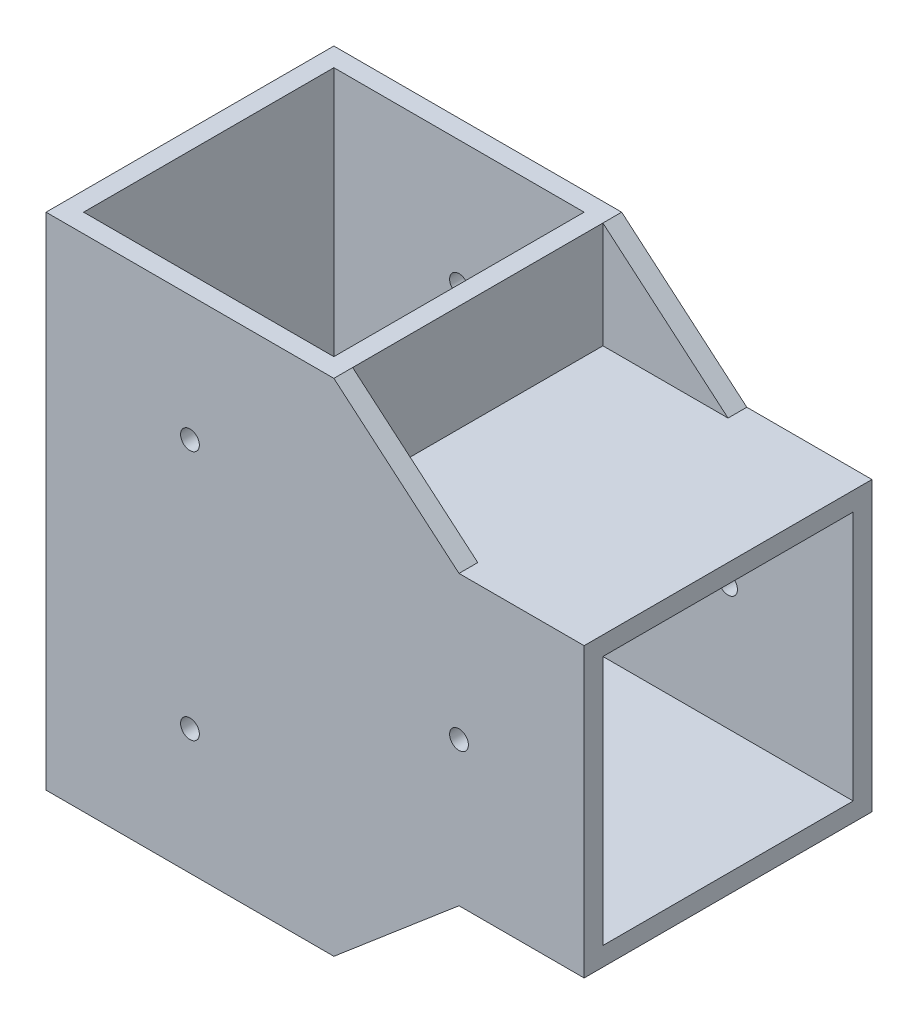
ISO-10303-21;
HEADER;
FILE_DESCRIPTION(('STEP AP214'),'2;1');
FILE_NAME('part.step','',(''),(''),'','','');
FILE_SCHEMA(('AUTOMOTIVE_DESIGN { 1 0 10303 214 1 1 1 1 }'));
ENDSEC;
DATA;
#1=APPLICATION_CONTEXT('core data for automotive mechanical design processes');
#2=APPLICATION_PROTOCOL_DEFINITION('international standard','automotive_design',2000,#1);
#3=PRODUCT_CONTEXT('',#1,'mechanical');
#4=PRODUCT('Part','Part','',(#3));
#5=PRODUCT_RELATED_PRODUCT_CATEGORY('part','',(#4));
#6=PRODUCT_DEFINITION_FORMATION('','',#4);
#7=PRODUCT_DEFINITION_CONTEXT('part definition',#1,'design');
#8=PRODUCT_DEFINITION('design','',#6,#7);
#9=PRODUCT_DEFINITION_SHAPE('','',#8);
#10=(LENGTH_UNIT() NAMED_UNIT(*) SI_UNIT(.MILLI.,.METRE.));
#11=(NAMED_UNIT(*) PLANE_ANGLE_UNIT() SI_UNIT($,.RADIAN.));
#12=(NAMED_UNIT(*) SI_UNIT($,.STERADIAN.) SOLID_ANGLE_UNIT());
#13=UNCERTAINTY_MEASURE_WITH_UNIT(LENGTH_MEASURE(1.E-05),#10,'distance_accuracy_value','');
#14=(GEOMETRIC_REPRESENTATION_CONTEXT(3) GLOBAL_UNCERTAINTY_ASSIGNED_CONTEXT((#13)) GLOBAL_UNIT_ASSIGNED_CONTEXT((#10,
#11,#12)) REPRESENTATION_CONTEXT('',''));
#15=CARTESIAN_POINT('',(0.,0.,0.));
#16=DIRECTION('',(0.,0.,1.));
#17=DIRECTION('',(1.,0.,0.));
#18=AXIS2_PLACEMENT_3D('',#15,#16,#17);
#19=CARTESIAN_POINT('',(0.,0.,3.));
#20=DIRECTION('',(0.,0.,-1.));
#21=DIRECTION('',(-1.,0.,0.));
#22=AXIS2_PLACEMENT_3D('',#19,#20,#21);
#23=PLANE('',#22);
#24=CARTESIAN_POINT('',(-43.,20.,3.));
#25=DIRECTION('',(0.,0.,-1.));
#26=DIRECTION('',(-1.,0.,0.));
#27=AXIS2_PLACEMENT_3D('',#24,#25,#26);
#28=CIRCLE('',#27,1.5);
#29=CARTESIAN_POINT('',(-44.5,20.,3.));
#30=VERTEX_POINT('',#29);
#31=EDGE_CURVE('E225',#30,#30,#28,.T.);
#32=ORIENTED_EDGE('',*,*,#31,.T.);
#33=EDGE_LOOP('',(#32));
#34=FACE_BOUND('',#33,.T.);
#35=CARTESIAN_POINT('',(-43.,-20.,3.));
#36=DIRECTION('',(0.,0.,-1.));
#37=DIRECTION('',(-1.,0.,0.));
#38=AXIS2_PLACEMENT_3D('',#35,#36,#37);
#39=CIRCLE('',#38,1.5);
#40=CARTESIAN_POINT('',(-44.5,-20.,3.));
#41=VERTEX_POINT('',#40);
#42=EDGE_CURVE('E474',#41,#41,#39,.T.);
#43=ORIENTED_EDGE('',*,*,#42,.T.);
#44=EDGE_LOOP('',(#43));
#45=FACE_BOUND('',#44,.T.);
#46=DIRECTION('',(0.,1.,0.));
#47=VECTOR('',#46,1.);
#48=CARTESIAN_POINT('',(-63.,40.,3.));
#49=LINE('',#48,#47);
#50=CARTESIAN_POINT('',(-63.,-40.,3.));
#51=VERTEX_POINT('',#50);
#52=CARTESIAN_POINT('',(-63.,40.,3.));
#53=VERTEX_POINT('',#52);
#54=EDGE_CURVE('E386',#51,#53,#49,.T.);
#55=ORIENTED_EDGE('',*,*,#54,.F.);
#56=DIRECTION('',(-1.,0.,0.));
#57=VECTOR('',#56,1.);
#58=CARTESIAN_POINT('',(-66.,-40.,3.));
#59=LINE('',#58,#57);
#60=CARTESIAN_POINT('',(-23.,-40.,3.));
#61=VERTEX_POINT('',#60);
#62=EDGE_CURVE('E353',#61,#51,#59,.T.);
#63=ORIENTED_EDGE('',*,*,#62,.F.);
#64=DIRECTION('',(0.,-1.,0.));
#65=VECTOR('',#64,1.);
#66=CARTESIAN_POINT('',(-23.,40.,3.));
#67=LINE('',#66,#65);
#68=CARTESIAN_POINT('',(-23.,40.,3.));
#69=VERTEX_POINT('',#68);
#70=EDGE_CURVE('E393',#69,#61,#67,.T.);
#71=ORIENTED_EDGE('',*,*,#70,.F.);
#72=DIRECTION('',(-1.,0.,0.));
#73=VECTOR('',#72,1.);
#74=CARTESIAN_POINT('',(-66.,40.,3.));
#75=LINE('',#74,#73);
#76=EDGE_CURVE('E61',#69,#53,#75,.T.);
#77=ORIENTED_EDGE('',*,*,#76,.T.);
#78=EDGE_LOOP('',(#55,#63,#71,#77));
#79=FACE_BOUND('',#78,.T.);
#80=ADVANCED_FACE('F43',(#34,#45,#79),#23,.F.);
#81=CARTESIAN_POINT('',(0.,0.,3.));
#82=DIRECTION('',(0.,0.,-1.));
#83=DIRECTION('',(-1.,0.,0.));
#84=AXIS2_PLACEMENT_3D('',#81,#82,#83);
#85=CIRCLE('',#84,1.5);
#86=CARTESIAN_POINT('',(-1.5,0.,3.));
#87=VERTEX_POINT('',#86);
#88=EDGE_CURVE('E468',#87,#87,#85,.T.);
#89=ORIENTED_EDGE('',*,*,#88,.T.);
#90=EDGE_LOOP('',(#89));
#91=FACE_BOUND('',#90,.T.);
#92=DIRECTION('',(1.,0.,0.));
#93=VECTOR('',#92,1.);
#94=CARTESIAN_POINT('',(-20.,20.,3.));
#95=LINE('',#94,#93);
#96=CARTESIAN_POINT('',(-20.,20.,3.));
#97=VERTEX_POINT('',#96);
#98=CARTESIAN_POINT('',(20.,20.,3.));
#99=VERTEX_POINT('',#98);
#100=EDGE_CURVE('E69',#97,#99,#95,.T.);
#101=ORIENTED_EDGE('',*,*,#100,.F.);
#102=DIRECTION('',(0.,1.,0.));
#103=VECTOR('',#102,1.);
#104=CARTESIAN_POINT('',(-20.,0.,3.));
#105=LINE('',#104,#103);
#106=CARTESIAN_POINT('',(-20.,-20.,3.));
#107=VERTEX_POINT('',#106);
#108=EDGE_CURVE('E396',#107,#97,#105,.T.);
#109=ORIENTED_EDGE('',*,*,#108,.F.);
#110=DIRECTION('',(1.,0.,0.));
#111=VECTOR('',#110,1.);
#112=CARTESIAN_POINT('',(-20.,-20.,3.));
#113=LINE('',#112,#111);
#114=CARTESIAN_POINT('',(20.,-20.,3.));
#115=VERTEX_POINT('',#114);
#116=EDGE_CURVE('E331',#107,#115,#113,.T.);
#117=ORIENTED_EDGE('',*,*,#116,.T.);
#118=DIRECTION('',(0.,1.,0.));
#119=VECTOR('',#118,1.);
#120=CARTESIAN_POINT('',(20.,23.,3.));
#121=LINE('',#120,#119);
#122=EDGE_CURVE('E422',#115,#99,#121,.T.);
#123=ORIENTED_EDGE('',*,*,#122,.T.);
#124=EDGE_LOOP('',(#101,#109,#117,#123));
#125=FACE_BOUND('',#124,.T.);
#126=ADVANCED_FACE('F568',(#91,#125),#23,.F.);
#127=DIRECTION('',(0.,1.,0.));
#128=VECTOR('',#127,1.);
#129=CARTESIAN_POINT('',(-20.,23.,3.));
#130=LINE('',#129,#128);
#131=CARTESIAN_POINT('',(-20.,23.,3.));
#132=VERTEX_POINT('',#131);
#133=CARTESIAN_POINT('',(-20.,40.,3.));
#134=VERTEX_POINT('',#133);
#135=EDGE_CURVE('E388',#132,#134,#130,.T.);
#136=ORIENTED_EDGE('',*,*,#135,.F.);
#137=DIRECTION('',(-1.,0.,0.));
#138=VECTOR('',#137,1.);
#139=CARTESIAN_POINT('',(20.,23.,3.));
#140=LINE('',#139,#138);
#141=CARTESIAN_POINT('',(0.,23.,3.));
#142=VERTEX_POINT('',#141);
#143=EDGE_CURVE('E11',#142,#132,#140,.T.);
#144=ORIENTED_EDGE('',*,*,#143,.F.);
#145=DIRECTION('',(-0.761939317759459,0.64764842009554,0.));
#146=VECTOR('',#145,1.);
#147=CARTESIAN_POINT('',(-20.,40.,3.));
#148=LINE('',#147,#146);
#149=EDGE_CURVE('E425',#142,#134,#148,.T.);
#150=ORIENTED_EDGE('',*,*,#149,.T.);
#151=EDGE_LOOP('',(#136,#144,#150));
#152=FACE_BOUND('',#151,.T.);
#153=ADVANCED_FACE('F548',(#152),#23,.F.);
#154=CARTESIAN_POINT('',(-66.,0.,3.));
#155=DIRECTION('',(1.,0.,0.));
#156=DIRECTION('',(0.,0.,-1.));
#157=AXIS2_PLACEMENT_3D('',#154,#155,#156);
#158=PLANE('',#157);
#159=DIRECTION('',(0.,-1.,0.));
#160=VECTOR('',#159,1.);
#161=CARTESIAN_POINT('',(-66.,0.,0.));
#162=LINE('',#161,#160);
#163=CARTESIAN_POINT('',(-66.,40.,0.));
#164=VERTEX_POINT('',#163);
#165=CARTESIAN_POINT('',(-66.,-40.,0.));
#166=VERTEX_POINT('',#165);
#167=EDGE_CURVE('E421',#164,#166,#162,.T.);
#168=ORIENTED_EDGE('',*,*,#167,.T.);
#169=DIRECTION('',(0.,0.,-1.));
#170=VECTOR('',#169,1.);
#171=CARTESIAN_POINT('',(-66.,-40.,3.));
#172=LINE('',#171,#170);
#173=CARTESIAN_POINT('',(-66.,-40.,46.));
#174=VERTEX_POINT('',#173);
#175=EDGE_CURVE('E358',#174,#166,#172,.T.);
#176=ORIENTED_EDGE('',*,*,#175,.F.);
#177=DIRECTION('',(0.,-1.,0.));
#178=VECTOR('',#177,1.);
#179=CARTESIAN_POINT('',(-66.,0.,46.));
#180=LINE('',#179,#178);
#181=CARTESIAN_POINT('',(-66.,40.,46.));
#182=VERTEX_POINT('',#181);
#183=EDGE_CURVE('E282',#182,#174,#180,.T.);
#184=ORIENTED_EDGE('',*,*,#183,.F.);
#185=DIRECTION('',(0.,0.,-1.));
#186=VECTOR('',#185,1.);
#187=CARTESIAN_POINT('',(-66.,40.,3.));
#188=LINE('',#187,#186);
#189=EDGE_CURVE('E431',#182,#164,#188,.T.);
#190=ORIENTED_EDGE('',*,*,#189,.T.);
#191=EDGE_LOOP('',(#168,#176,#184,#190));
#192=FACE_BOUND('',#191,.T.);
#193=ADVANCED_FACE('F45',(#192),#158,.F.);
#194=CARTESIAN_POINT('',(20.,23.,3.));
#195=DIRECTION('',(-1.,0.,0.));
#196=DIRECTION('',(0.,-1.,0.));
#197=AXIS2_PLACEMENT_3D('',#194,#195,#196);
#198=PLANE('',#197);
#199=DIRECTION('',(0.,0.,-1.));
#200=VECTOR('',#199,1.);
#201=CARTESIAN_POINT('',(20.,23.,3.));
#202=LINE('',#201,#200);
#203=CARTESIAN_POINT('',(20.,23.,46.));
#204=VERTEX_POINT('',#203);
#205=CARTESIAN_POINT('',(20.,23.,0.));
#206=VERTEX_POINT('',#205);
#207=EDGE_CURVE('E53',#204,#206,#202,.T.);
#208=ORIENTED_EDGE('',*,*,#207,.F.);
#209=DIRECTION('',(0.,1.,0.));
#210=VECTOR('',#209,1.);
#211=CARTESIAN_POINT('',(20.,23.,46.));
#212=LINE('',#211,#210);
#213=CARTESIAN_POINT('',(20.,-23.,46.));
#214=VERTEX_POINT('',#213);
#215=EDGE_CURVE('E300',#214,#204,#212,.T.);
#216=ORIENTED_EDGE('',*,*,#215,.F.);
#217=DIRECTION('',(0.,0.,-1.));
#218=VECTOR('',#217,1.);
#219=CARTESIAN_POINT('',(20.,-23.,3.));
#220=LINE('',#219,#218);
#221=CARTESIAN_POINT('',(20.,-23.,0.));
#222=VERTEX_POINT('',#221);
#223=EDGE_CURVE('E328',#214,#222,#220,.T.);
#224=ORIENTED_EDGE('',*,*,#223,.T.);
#225=DIRECTION('',(0.,1.,0.));
#226=VECTOR('',#225,1.);
#227=CARTESIAN_POINT('',(20.,23.,0.));
#228=LINE('',#227,#226);
#229=EDGE_CURVE('E434',#222,#206,#228,.T.);
#230=ORIENTED_EDGE('',*,*,#229,.T.);
#231=EDGE_LOOP('',(#208,#216,#224,#230));
#232=FACE_BOUND('',#231,.T.);
#233=DIRECTION('',(0.,1.,0.));
#234=VECTOR('',#233,1.);
#235=CARTESIAN_POINT('',(20.,23.,43.));
#236=LINE('',#235,#234);
#237=CARTESIAN_POINT('',(20.,-20.,43.));
#238=VERTEX_POINT('',#237);
#239=CARTESIAN_POINT('',(20.,20.,43.));
#240=VERTEX_POINT('',#239);
#241=EDGE_CURVE('E283',#238,#240,#236,.T.);
#242=ORIENTED_EDGE('',*,*,#241,.T.);
#243=DIRECTION('',(0.,0.,-1.));
#244=VECTOR('',#243,1.);
#245=CARTESIAN_POINT('',(20.,20.,23.));
#246=LINE('',#245,#244);
#247=EDGE_CURVE('E401',#240,#99,#246,.T.);
#248=ORIENTED_EDGE('',*,*,#247,.T.);
#249=ORIENTED_EDGE('',*,*,#122,.F.);
#250=DIRECTION('',(0.,0.,-1.));
#251=VECTOR('',#250,1.);
#252=CARTESIAN_POINT('',(20.,-20.,23.));
#253=LINE('',#252,#251);
#254=EDGE_CURVE('E335',#238,#115,#253,.T.);
#255=ORIENTED_EDGE('',*,*,#254,.F.);
#256=EDGE_LOOP('',(#242,#248,#249,#255));
#257=FACE_BOUND('',#256,.T.);
#258=ADVANCED_FACE('F521',(#232,#257),#198,.F.);
#259=CARTESIAN_POINT('',(0.,23.,3.));
#260=DIRECTION('',(0.,-1.,0.));
#261=DIRECTION('',(0.,0.,-1.));
#262=AXIS2_PLACEMENT_3D('',#259,#260,#261);
#263=PLANE('',#262);
#264=DIRECTION('',(-1.,0.,0.));
#265=VECTOR('',#264,1.);
#266=CARTESIAN_POINT('',(0.,23.,0.));
#267=LINE('',#266,#265);
#268=CARTESIAN_POINT('',(0.,23.,0.));
#269=VERTEX_POINT('',#268);
#270=EDGE_CURVE('E437',#206,#269,#267,.T.);
#271=ORIENTED_EDGE('',*,*,#270,.T.);
#272=DIRECTION('',(0.,0.,-1.));
#273=VECTOR('',#272,1.);
#274=CARTESIAN_POINT('',(0.,23.,3.));
#275=LINE('',#274,#273);
#276=EDGE_CURVE('E452',#142,#269,#275,.T.);
#277=ORIENTED_EDGE('',*,*,#276,.F.);
#278=ORIENTED_EDGE('',*,*,#143,.T.);
#279=DIRECTION('',(0.,0.,-1.));
#280=VECTOR('',#279,1.);
#281=CARTESIAN_POINT('',(-20.,23.,23.));
#282=LINE('',#281,#280);
#283=CARTESIAN_POINT('',(-20.,23.,43.));
#284=VERTEX_POINT('',#283);
#285=EDGE_CURVE('E417',#284,#132,#282,.T.);
#286=ORIENTED_EDGE('',*,*,#285,.F.);
#287=DIRECTION('',(-1.,0.,0.));
#288=VECTOR('',#287,1.);
#289=CARTESIAN_POINT('',(20.,23.,43.));
#290=LINE('',#289,#288);
#291=CARTESIAN_POINT('',(0.,23.,43.));
#292=VERTEX_POINT('',#291);
#293=EDGE_CURVE('E261',#292,#284,#290,.T.);
#294=ORIENTED_EDGE('',*,*,#293,.F.);
#295=DIRECTION('',(0.,0.,1.));
#296=VECTOR('',#295,1.);
#297=CARTESIAN_POINT('',(0.,23.,43.));
#298=LINE('',#297,#296);
#299=CARTESIAN_POINT('',(0.,23.,46.));
#300=VERTEX_POINT('',#299);
#301=EDGE_CURVE('E266',#292,#300,#298,.T.);
#302=ORIENTED_EDGE('',*,*,#301,.T.);
#303=DIRECTION('',(-1.,0.,0.));
#304=VECTOR('',#303,1.);
#305=CARTESIAN_POINT('',(0.,23.,46.));
#306=LINE('',#305,#304);
#307=EDGE_CURVE('E304',#204,#300,#306,.T.);
#308=ORIENTED_EDGE('',*,*,#307,.F.);
#309=ORIENTED_EDGE('',*,*,#207,.T.);
#310=EDGE_LOOP('',(#271,#277,#278,#286,#294,#302,#308,#309));
#311=FACE_BOUND('',#310,.T.);
#312=ADVANCED_FACE('F526',(#311),#263,.F.);
#313=CARTESIAN_POINT('',(-20.,40.,3.));
#314=DIRECTION('',(-0.64764842009554,-0.761939317759459,0.));
#315=DIRECTION('',(0.76193931775946,-0.64764842009554,0.));
#316=AXIS2_PLACEMENT_3D('',#313,#314,#315);
#317=PLANE('',#316);
#318=DIRECTION('',(-0.761939317759459,0.64764842009554,0.));
#319=VECTOR('',#318,1.);
#320=CARTESIAN_POINT('',(-20.,40.,0.));
#321=LINE('',#320,#319);
#322=CARTESIAN_POINT('',(-20.,40.,0.));
#323=VERTEX_POINT('',#322);
#324=EDGE_CURVE('E440',#269,#323,#321,.T.);
#325=ORIENTED_EDGE('',*,*,#324,.T.);
#326=DIRECTION('',(0.,0.,-1.));
#327=VECTOR('',#326,1.);
#328=CARTESIAN_POINT('',(-20.,40.,3.));
#329=LINE('',#328,#327);
#330=EDGE_CURVE('E448',#134,#323,#329,.T.);
#331=ORIENTED_EDGE('',*,*,#330,.F.);
#332=ORIENTED_EDGE('',*,*,#149,.F.);
#333=ORIENTED_EDGE('',*,*,#276,.T.);
#334=EDGE_LOOP('',(#325,#331,#332,#333));
#335=FACE_BOUND('',#334,.T.);
#336=ADVANCED_FACE('F546',(#335),#317,.F.);
#337=CARTESIAN_POINT('',(-66.,40.,3.));
#338=DIRECTION('',(0.,-1.,0.));
#339=DIRECTION('',(0.,0.,-1.));
#340=AXIS2_PLACEMENT_3D('',#337,#338,#339);
#341=PLANE('',#340);
#342=DIRECTION('',(0.,0.,-1.));
#343=VECTOR('',#342,1.);
#344=CARTESIAN_POINT('',(-23.,40.,23.));
#345=LINE('',#344,#343);
#346=CARTESIAN_POINT('',(-23.,40.,43.));
#347=VERTEX_POINT('',#346);
#348=EDGE_CURVE('E409',#347,#69,#345,.T.);
#349=ORIENTED_EDGE('',*,*,#348,.F.);
#350=DIRECTION('',(-1.,0.,0.));
#351=VECTOR('',#350,1.);
#352=CARTESIAN_POINT('',(-66.,40.,43.));
#353=LINE('',#352,#351);
#354=CARTESIAN_POINT('',(-63.,40.,43.));
#355=VERTEX_POINT('',#354);
#356=EDGE_CURVE('E292',#347,#355,#353,.T.);
#357=ORIENTED_EDGE('',*,*,#356,.T.);
#358=DIRECTION('',(0.,0.,-1.));
#359=VECTOR('',#358,1.);
#360=CARTESIAN_POINT('',(-63.,40.,23.));
#361=LINE('',#360,#359);
#362=EDGE_CURVE('E327',#355,#53,#361,.T.);
#363=ORIENTED_EDGE('',*,*,#362,.T.);
#364=ORIENTED_EDGE('',*,*,#76,.F.);
#365=EDGE_LOOP('',(#349,#357,#363,#364));
#366=FACE_BOUND('',#365,.T.);
#367=DIRECTION('',(-1.,0.,0.));
#368=VECTOR('',#367,1.);
#369=CARTESIAN_POINT('',(-66.,40.,0.));
#370=LINE('',#369,#368);
#371=EDGE_CURVE('E426',#323,#164,#370,.T.);
#372=ORIENTED_EDGE('',*,*,#371,.T.);
#373=ORIENTED_EDGE('',*,*,#189,.F.);
#374=DIRECTION('',(-1.,0.,0.));
#375=VECTOR('',#374,1.);
#376=CARTESIAN_POINT('',(-66.,40.,46.));
#377=LINE('',#376,#375);
#378=CARTESIAN_POINT('',(-20.,40.,46.));
#379=VERTEX_POINT('',#378);
#380=EDGE_CURVE('E288',#379,#182,#377,.T.);
#381=ORIENTED_EDGE('',*,*,#380,.F.);
#382=DIRECTION('',(0.,0.,1.));
#383=VECTOR('',#382,1.);
#384=CARTESIAN_POINT('',(-20.,40.,43.));
#385=LINE('',#384,#383);
#386=CARTESIAN_POINT('',(-20.,40.,43.));
#387=VERTEX_POINT('',#386);
#388=EDGE_CURVE('E296',#387,#379,#385,.T.);
#389=ORIENTED_EDGE('',*,*,#388,.F.);
#390=DIRECTION('',(0.,0.,-1.));
#391=VECTOR('',#390,1.);
#392=CARTESIAN_POINT('',(-20.,40.,23.));
#393=LINE('',#392,#391);
#394=EDGE_CURVE('E413',#387,#134,#393,.T.);
#395=ORIENTED_EDGE('',*,*,#394,.T.);
#396=ORIENTED_EDGE('',*,*,#330,.T.);
#397=EDGE_LOOP('',(#372,#373,#381,#389,#395,#396));
#398=FACE_BOUND('',#397,.T.);
#399=ADVANCED_FACE('F532',(#366,#398),#341,.F.);
#400=CARTESIAN_POINT('',(0.,0.,0.));
#401=DIRECTION('',(0.,0.,-1.));
#402=DIRECTION('',(-1.,0.,0.));
#403=AXIS2_PLACEMENT_3D('',#400,#401,#402);
#404=PLANE('',#403);
#405=CARTESIAN_POINT('',(-43.,20.,0.));
#406=DIRECTION('',(0.,0.,1.));
#407=DIRECTION('',(1.,0.,0.));
#408=AXIS2_PLACEMENT_3D('',#405,#406,#407);
#409=CIRCLE('',#408,1.5);
#410=CARTESIAN_POINT('',(-41.5,20.,0.));
#411=VERTEX_POINT('',#410);
#412=EDGE_CURVE('E463',#411,#411,#409,.T.);
#413=ORIENTED_EDGE('',*,*,#412,.T.);
#414=EDGE_LOOP('',(#413));
#415=FACE_BOUND('',#414,.T.);
#416=CARTESIAN_POINT('',(-43.,-20.,0.));
#417=DIRECTION('',(0.,0.,1.));
#418=DIRECTION('',(1.,0.,0.));
#419=AXIS2_PLACEMENT_3D('',#416,#417,#418);
#420=CIRCLE('',#419,1.5);
#421=CARTESIAN_POINT('',(-41.5,-20.,0.));
#422=VERTEX_POINT('',#421);
#423=EDGE_CURVE('E605',#422,#422,#420,.T.);
#424=ORIENTED_EDGE('',*,*,#423,.T.);
#425=EDGE_LOOP('',(#424));
#426=FACE_BOUND('',#425,.T.);
#427=CARTESIAN_POINT('',(0.,0.,0.));
#428=DIRECTION('',(0.,0.,1.));
#429=DIRECTION('',(1.,0.,0.));
#430=AXIS2_PLACEMENT_3D('',#427,#428,#429);
#431=CIRCLE('',#430,1.5);
#432=CARTESIAN_POINT('',(1.5,0.,0.));
#433=VERTEX_POINT('',#432);
#434=EDGE_CURVE('E608',#433,#433,#431,.T.);
#435=ORIENTED_EDGE('',*,*,#434,.T.);
#436=EDGE_LOOP('',(#435));
#437=FACE_BOUND('',#436,.T.);
#438=ORIENTED_EDGE('',*,*,#167,.F.);
#439=ORIENTED_EDGE('',*,*,#371,.F.);
#440=ORIENTED_EDGE('',*,*,#324,.F.);
#441=ORIENTED_EDGE('',*,*,#270,.F.);
#442=ORIENTED_EDGE('',*,*,#229,.F.);
#443=DIRECTION('',(-1.,0.,0.));
#444=VECTOR('',#443,1.);
#445=CARTESIAN_POINT('',(0.,-23.,0.));
#446=LINE('',#445,#444);
#447=CARTESIAN_POINT('',(0.,-23.,0.));
#448=VERTEX_POINT('',#447);
#449=EDGE_CURVE('E206',#222,#448,#446,.T.);
#450=ORIENTED_EDGE('',*,*,#449,.T.);
#451=DIRECTION('',(-0.761939317759459,-0.64764842009554,0.));
#452=VECTOR('',#451,1.);
#453=CARTESIAN_POINT('',(-20.,-40.,0.));
#454=LINE('',#453,#452);
#455=CARTESIAN_POINT('',(-20.,-40.,0.));
#456=VERTEX_POINT('',#455);
#457=EDGE_CURVE('E362',#448,#456,#454,.T.);
#458=ORIENTED_EDGE('',*,*,#457,.T.);
#459=DIRECTION('',(-1.,0.,0.));
#460=VECTOR('',#459,1.);
#461=CARTESIAN_POINT('',(-66.,-40.,0.));
#462=LINE('',#461,#460);
#463=EDGE_CURVE('E354',#456,#166,#462,.T.);
#464=ORIENTED_EDGE('',*,*,#463,.T.);
#465=EDGE_LOOP('',(#438,#439,#440,#441,#442,#450,#458,#464));
#466=FACE_BOUND('',#465,.T.);
#467=ADVANCED_FACE('F537',(#415,#426,#437,#466),#404,.T.);
#468=CARTESIAN_POINT('',(-20.,23.,23.));
#469=DIRECTION('',(-1.,0.,0.));
#470=DIRECTION('',(0.,0.,1.));
#471=AXIS2_PLACEMENT_3D('',#468,#469,#470);
#472=PLANE('',#471);
#473=ORIENTED_EDGE('',*,*,#135,.T.);
#474=ORIENTED_EDGE('',*,*,#394,.F.);
#475=DIRECTION('',(0.,1.,0.));
#476=VECTOR('',#475,1.);
#477=CARTESIAN_POINT('',(-20.,23.,43.));
#478=LINE('',#477,#476);
#479=EDGE_CURVE('E260',#284,#387,#478,.T.);
#480=ORIENTED_EDGE('',*,*,#479,.F.);
#481=ORIENTED_EDGE('',*,*,#285,.T.);
#482=EDGE_LOOP('',(#473,#474,#480,#481));
#483=FACE_BOUND('',#482,.T.);
#484=ADVANCED_FACE('F551',(#483),#472,.F.);
#485=CARTESIAN_POINT('',(-23.,40.,23.));
#486=DIRECTION('',(1.,0.,0.));
#487=DIRECTION('',(0.,1.,0.));
#488=AXIS2_PLACEMENT_3D('',#485,#486,#487);
#489=PLANE('',#488);
#490=ORIENTED_EDGE('',*,*,#70,.T.);
#491=DIRECTION('',(0.,0.,-1.));
#492=VECTOR('',#491,1.);
#493=CARTESIAN_POINT('',(-23.,-40.,23.));
#494=LINE('',#493,#492);
#495=CARTESIAN_POINT('',(-23.,-40.,43.));
#496=VERTEX_POINT('',#495);
#497=EDGE_CURVE('E343',#496,#61,#494,.T.);
#498=ORIENTED_EDGE('',*,*,#497,.F.);
#499=DIRECTION('',(0.,-1.,0.));
#500=VECTOR('',#499,1.);
#501=CARTESIAN_POINT('',(-23.,40.,43.));
#502=LINE('',#501,#500);
#503=EDGE_CURVE('E270',#347,#496,#502,.T.);
#504=ORIENTED_EDGE('',*,*,#503,.F.);
#505=ORIENTED_EDGE('',*,*,#348,.T.);
#506=EDGE_LOOP('',(#490,#498,#504,#505));
#507=FACE_BOUND('',#506,.T.);
#508=ADVANCED_FACE('F598',(#507),#489,.F.);
#509=CARTESIAN_POINT('',(-20.,0.,23.));
#510=DIRECTION('',(-1.,0.,0.));
#511=DIRECTION('',(0.,0.,1.));
#512=AXIS2_PLACEMENT_3D('',#509,#510,#511);
#513=PLANE('',#512);
#514=ORIENTED_EDGE('',*,*,#108,.T.);
#515=DIRECTION('',(0.,0.,-1.));
#516=VECTOR('',#515,1.);
#517=CARTESIAN_POINT('',(-20.,20.,23.));
#518=LINE('',#517,#516);
#519=CARTESIAN_POINT('',(-20.,20.,43.));
#520=VERTEX_POINT('',#519);
#521=EDGE_CURVE('E405',#520,#97,#518,.T.);
#522=ORIENTED_EDGE('',*,*,#521,.F.);
#523=DIRECTION('',(0.,1.,0.));
#524=VECTOR('',#523,1.);
#525=CARTESIAN_POINT('',(-20.,0.,43.));
#526=LINE('',#525,#524);
#527=CARTESIAN_POINT('',(-20.,-20.,43.));
#528=VERTEX_POINT('',#527);
#529=EDGE_CURVE('E274',#528,#520,#526,.T.);
#530=ORIENTED_EDGE('',*,*,#529,.F.);
#531=DIRECTION('',(0.,0.,-1.));
#532=VECTOR('',#531,1.);
#533=CARTESIAN_POINT('',(-20.,-20.,23.));
#534=LINE('',#533,#532);
#535=EDGE_CURVE('E339',#528,#107,#534,.T.);
#536=ORIENTED_EDGE('',*,*,#535,.T.);
#537=EDGE_LOOP('',(#514,#522,#530,#536));
#538=FACE_BOUND('',#537,.T.);
#539=ADVANCED_FACE('F649',(#538),#513,.F.);
#540=CARTESIAN_POINT('',(-20.,20.,23.));
#541=DIRECTION('',(0.,1.,0.));
#542=DIRECTION('',(0.,0.,1.));
#543=AXIS2_PLACEMENT_3D('',#540,#541,#542);
#544=PLANE('',#543);
#545=ORIENTED_EDGE('',*,*,#100,.T.);
#546=ORIENTED_EDGE('',*,*,#247,.F.);
#547=DIRECTION('',(1.,0.,0.));
#548=VECTOR('',#547,1.);
#549=CARTESIAN_POINT('',(-20.,20.,43.));
#550=LINE('',#549,#548);
#551=EDGE_CURVE('E278',#520,#240,#550,.T.);
#552=ORIENTED_EDGE('',*,*,#551,.F.);
#553=ORIENTED_EDGE('',*,*,#521,.T.);
#554=EDGE_LOOP('',(#545,#546,#552,#553));
#555=FACE_BOUND('',#554,.T.);
#556=ADVANCED_FACE('F645',(#555),#544,.F.);
#557=CARTESIAN_POINT('',(-63.,40.,23.));
#558=DIRECTION('',(-1.,0.,0.));
#559=DIRECTION('',(0.,0.,1.));
#560=AXIS2_PLACEMENT_3D('',#557,#558,#559);
#561=PLANE('',#560);
#562=ORIENTED_EDGE('',*,*,#54,.T.);
#563=ORIENTED_EDGE('',*,*,#362,.F.);
#564=DIRECTION('',(0.,1.,0.));
#565=VECTOR('',#564,1.);
#566=CARTESIAN_POINT('',(-63.,40.,43.));
#567=LINE('',#566,#565);
#568=CARTESIAN_POINT('',(-63.,-40.,43.));
#569=VERTEX_POINT('',#568);
#570=EDGE_CURVE('E219',#569,#355,#567,.T.);
#571=ORIENTED_EDGE('',*,*,#570,.F.);
#572=DIRECTION('',(0.,0.,-1.));
#573=VECTOR('',#572,1.);
#574=CARTESIAN_POINT('',(-63.,-40.,23.));
#575=LINE('',#574,#573);
#576=EDGE_CURVE('E265',#569,#51,#575,.T.);
#577=ORIENTED_EDGE('',*,*,#576,.T.);
#578=EDGE_LOOP('',(#562,#563,#571,#577));
#579=FACE_BOUND('',#578,.T.);
#580=ADVANCED_FACE('F656',(#579),#561,.F.);
#581=CARTESIAN_POINT('',(0.,0.,3.));
#582=DIRECTION('',(0.,0.,-1.));
#583=DIRECTION('',(-1.,0.,0.));
#584=AXIS2_PLACEMENT_3D('',#581,#582,#583);
#585=PLANE('',#584);
#586=DIRECTION('',(0.,-1.,0.));
#587=VECTOR('',#586,1.);
#588=CARTESIAN_POINT('',(-20.,-23.,3.));
#589=LINE('',#588,#587);
#590=CARTESIAN_POINT('',(-20.,-23.,3.));
#591=VERTEX_POINT('',#590);
#592=CARTESIAN_POINT('',(-20.,-40.,3.));
#593=VERTEX_POINT('',#592);
#594=EDGE_CURVE('E201',#591,#593,#589,.T.);
#595=ORIENTED_EDGE('',*,*,#594,.T.);
#596=DIRECTION('',(-0.761939317759459,-0.64764842009554,0.));
#597=VECTOR('',#596,1.);
#598=CARTESIAN_POINT('',(-20.,-40.,3.));
#599=LINE('',#598,#597);
#600=CARTESIAN_POINT('',(0.,-23.,3.));
#601=VERTEX_POINT('',#600);
#602=EDGE_CURVE('E349',#601,#593,#599,.T.);
#603=ORIENTED_EDGE('',*,*,#602,.F.);
#604=DIRECTION('',(-1.,0.,0.));
#605=VECTOR('',#604,1.);
#606=CARTESIAN_POINT('',(20.,-23.,3.));
#607=LINE('',#606,#605);
#608=EDGE_CURVE('E324',#601,#591,#607,.T.);
#609=ORIENTED_EDGE('',*,*,#608,.T.);
#610=EDGE_LOOP('',(#595,#603,#609));
#611=FACE_BOUND('',#610,.T.);
#612=ADVANCED_FACE('F542',(#611),#585,.F.);
#613=CARTESIAN_POINT('',(0.,-23.,3.));
#614=DIRECTION('',(0.,1.,0.));
#615=DIRECTION('',(0.,0.,-1.));
#616=AXIS2_PLACEMENT_3D('',#613,#614,#615);
#617=PLANE('',#616);
#618=ORIENTED_EDGE('',*,*,#449,.F.);
#619=ORIENTED_EDGE('',*,*,#223,.F.);
#620=DIRECTION('',(-1.,0.,0.));
#621=VECTOR('',#620,1.);
#622=CARTESIAN_POINT('',(0.,-23.,46.));
#623=LINE('',#622,#621);
#624=CARTESIAN_POINT('',(0.,-23.,46.));
#625=VERTEX_POINT('',#624);
#626=EDGE_CURVE('E230',#214,#625,#623,.T.);
#627=ORIENTED_EDGE('',*,*,#626,.T.);
#628=DIRECTION('',(0.,0.,1.));
#629=VECTOR('',#628,1.);
#630=CARTESIAN_POINT('',(0.,-23.,43.));
#631=LINE('',#630,#629);
#632=CARTESIAN_POINT('',(0.,-23.,43.));
#633=VERTEX_POINT('',#632);
#634=EDGE_CURVE('E214',#633,#625,#631,.T.);
#635=ORIENTED_EDGE('',*,*,#634,.F.);
#636=DIRECTION('',(-1.,0.,0.));
#637=VECTOR('',#636,1.);
#638=CARTESIAN_POINT('',(20.,-23.,43.));
#639=LINE('',#638,#637);
#640=CARTESIAN_POINT('',(-20.,-23.,43.));
#641=VERTEX_POINT('',#640);
#642=EDGE_CURVE('E210',#633,#641,#639,.T.);
#643=ORIENTED_EDGE('',*,*,#642,.T.);
#644=DIRECTION('',(0.,0.,-1.));
#645=VECTOR('',#644,1.);
#646=CARTESIAN_POINT('',(-20.,-23.,23.));
#647=LINE('',#646,#645);
#648=EDGE_CURVE('E195',#641,#591,#647,.T.);
#649=ORIENTED_EDGE('',*,*,#648,.T.);
#650=ORIENTED_EDGE('',*,*,#608,.F.);
#651=DIRECTION('',(0.,0.,-1.));
#652=VECTOR('',#651,1.);
#653=CARTESIAN_POINT('',(0.,-23.,3.));
#654=LINE('',#653,#652);
#655=EDGE_CURVE('E376',#601,#448,#654,.T.);
#656=ORIENTED_EDGE('',*,*,#655,.T.);
#657=EDGE_LOOP('',(#618,#619,#627,#635,#643,#649,#650,#656));
#658=FACE_BOUND('',#657,.T.);
#659=ADVANCED_FACE('F212',(#658),#617,.F.);
#660=CARTESIAN_POINT('',(-20.,-40.,3.));
#661=DIRECTION('',(-0.64764842009554,0.761939317759459,0.));
#662=DIRECTION('',(0.76193931775946,0.64764842009554,0.));
#663=AXIS2_PLACEMENT_3D('',#660,#661,#662);
#664=PLANE('',#663);
#665=ORIENTED_EDGE('',*,*,#457,.F.);
#666=ORIENTED_EDGE('',*,*,#655,.F.);
#667=ORIENTED_EDGE('',*,*,#602,.T.);
#668=DIRECTION('',(0.,0.,-1.));
#669=VECTOR('',#668,1.);
#670=CARTESIAN_POINT('',(-20.,-40.,3.));
#671=LINE('',#670,#669);
#672=EDGE_CURVE('E372',#593,#456,#671,.T.);
#673=ORIENTED_EDGE('',*,*,#672,.T.);
#674=EDGE_LOOP('',(#665,#666,#667,#673));
#675=FACE_BOUND('',#674,.T.);
#676=ADVANCED_FACE('F539',(#675),#664,.F.);
#677=CARTESIAN_POINT('',(-66.,-40.,3.));
#678=DIRECTION('',(0.,1.,0.));
#679=DIRECTION('',(0.,0.,-1.));
#680=AXIS2_PLACEMENT_3D('',#677,#678,#679);
#681=PLANE('',#680);
#682=DIRECTION('',(-1.,0.,0.));
#683=VECTOR('',#682,1.);
#684=CARTESIAN_POINT('',(-66.,-40.,43.));
#685=LINE('',#684,#683);
#686=EDGE_CURVE('E238',#496,#569,#685,.T.);
#687=ORIENTED_EDGE('',*,*,#686,.F.);
#688=ORIENTED_EDGE('',*,*,#497,.T.);
#689=ORIENTED_EDGE('',*,*,#62,.T.);
#690=ORIENTED_EDGE('',*,*,#576,.F.);
#691=EDGE_LOOP('',(#687,#688,#689,#690));
#692=FACE_BOUND('',#691,.T.);
#693=ORIENTED_EDGE('',*,*,#463,.F.);
#694=ORIENTED_EDGE('',*,*,#672,.F.);
#695=DIRECTION('',(0.,0.,-1.));
#696=VECTOR('',#695,1.);
#697=CARTESIAN_POINT('',(-20.,-40.,23.));
#698=LINE('',#697,#696);
#699=CARTESIAN_POINT('',(-20.,-40.,43.));
#700=VERTEX_POINT('',#699);
#701=EDGE_CURVE('E207',#700,#593,#698,.T.);
#702=ORIENTED_EDGE('',*,*,#701,.F.);
#703=DIRECTION('',(0.,0.,1.));
#704=VECTOR('',#703,1.);
#705=CARTESIAN_POINT('',(-20.,-40.,43.));
#706=LINE('',#705,#704);
#707=CARTESIAN_POINT('',(-20.,-40.,46.));
#708=VERTEX_POINT('',#707);
#709=EDGE_CURVE('E243',#700,#708,#706,.T.);
#710=ORIENTED_EDGE('',*,*,#709,.T.);
#711=DIRECTION('',(-1.,0.,0.));
#712=VECTOR('',#711,1.);
#713=CARTESIAN_POINT('',(-66.,-40.,46.));
#714=LINE('',#713,#712);
#715=EDGE_CURVE('E239',#708,#174,#714,.T.);
#716=ORIENTED_EDGE('',*,*,#715,.T.);
#717=ORIENTED_EDGE('',*,*,#175,.T.);
#718=EDGE_LOOP('',(#693,#694,#702,#710,#716,#717));
#719=FACE_BOUND('',#718,.T.);
#720=ADVANCED_FACE('F513',(#692,#719),#681,.F.);
#721=CARTESIAN_POINT('',(-20.,-23.,23.));
#722=DIRECTION('',(-1.,0.,0.));
#723=DIRECTION('',(0.,0.,1.));
#724=AXIS2_PLACEMENT_3D('',#721,#722,#723);
#725=PLANE('',#724);
#726=ORIENTED_EDGE('',*,*,#594,.F.);
#727=ORIENTED_EDGE('',*,*,#648,.F.);
#728=DIRECTION('',(0.,-1.,0.));
#729=VECTOR('',#728,1.);
#730=CARTESIAN_POINT('',(-20.,-23.,43.));
#731=LINE('',#730,#729);
#732=EDGE_CURVE('E199',#641,#700,#731,.T.);
#733=ORIENTED_EDGE('',*,*,#732,.T.);
#734=ORIENTED_EDGE('',*,*,#701,.T.);
#735=EDGE_LOOP('',(#726,#727,#733,#734));
#736=FACE_BOUND('',#735,.T.);
#737=ADVANCED_FACE('F197',(#736),#725,.F.);
#738=CARTESIAN_POINT('',(-20.,-20.,23.));
#739=DIRECTION('',(0.,-1.,0.));
#740=DIRECTION('',(0.,0.,1.));
#741=AXIS2_PLACEMENT_3D('',#738,#739,#740);
#742=PLANE('',#741);
#743=ORIENTED_EDGE('',*,*,#116,.F.);
#744=ORIENTED_EDGE('',*,*,#535,.F.);
#745=DIRECTION('',(1.,0.,0.));
#746=VECTOR('',#745,1.);
#747=CARTESIAN_POINT('',(-20.,-20.,43.));
#748=LINE('',#747,#746);
#749=EDGE_CURVE('E224',#528,#238,#748,.T.);
#750=ORIENTED_EDGE('',*,*,#749,.T.);
#751=ORIENTED_EDGE('',*,*,#254,.T.);
#752=EDGE_LOOP('',(#743,#744,#750,#751));
#753=FACE_BOUND('',#752,.T.);
#754=ADVANCED_FACE('F566',(#753),#742,.F.);
#755=CARTESIAN_POINT('',(0.,0.,43.));
#756=DIRECTION('',(0.,0.,1.));
#757=DIRECTION('',(-1.,0.,0.));
#758=AXIS2_PLACEMENT_3D('',#755,#756,#757);
#759=PLANE('',#758);
#760=CARTESIAN_POINT('',(-43.,20.,43.));
#761=DIRECTION('',(0.,0.,1.));
#762=DIRECTION('',(1.,0.,0.));
#763=AXIS2_PLACEMENT_3D('',#760,#761,#762);
#764=CIRCLE('',#763,1.5);
#765=CARTESIAN_POINT('',(-41.5,20.,43.));
#766=VERTEX_POINT('',#765);
#767=EDGE_CURVE('E233',#766,#766,#764,.T.);
#768=ORIENTED_EDGE('',*,*,#767,.T.);
#769=EDGE_LOOP('',(#768));
#770=FACE_BOUND('',#769,.T.);
#771=CARTESIAN_POINT('',(-43.,-20.,43.));
#772=DIRECTION('',(0.,0.,1.));
#773=DIRECTION('',(1.,0.,0.));
#774=AXIS2_PLACEMENT_3D('',#771,#772,#773);
#775=CIRCLE('',#774,1.5);
#776=CARTESIAN_POINT('',(-41.5,-20.,43.));
#777=VERTEX_POINT('',#776);
#778=EDGE_CURVE('E467',#777,#777,#775,.T.);
#779=ORIENTED_EDGE('',*,*,#778,.T.);
#780=EDGE_LOOP('',(#779));
#781=FACE_BOUND('',#780,.T.);
#782=ORIENTED_EDGE('',*,*,#570,.T.);
#783=ORIENTED_EDGE('',*,*,#356,.F.);
#784=ORIENTED_EDGE('',*,*,#503,.T.);
#785=ORIENTED_EDGE('',*,*,#686,.T.);
#786=EDGE_LOOP('',(#782,#783,#784,#785));
#787=FACE_BOUND('',#786,.T.);
#788=ADVANCED_FACE('F557',(#770,#781,#787),#759,.F.);
#789=CARTESIAN_POINT('',(0.,0.,43.));
#790=DIRECTION('',(0.,0.,1.));
#791=DIRECTION('',(1.,0.,0.));
#792=AXIS2_PLACEMENT_3D('',#789,#790,#791);
#793=CIRCLE('',#792,1.5);
#794=CARTESIAN_POINT('',(1.5,0.,43.));
#795=VERTEX_POINT('',#794);
#796=EDGE_CURVE('E462',#795,#795,#793,.T.);
#797=ORIENTED_EDGE('',*,*,#796,.T.);
#798=EDGE_LOOP('',(#797));
#799=FACE_BOUND('',#798,.T.);
#800=ORIENTED_EDGE('',*,*,#551,.T.);
#801=ORIENTED_EDGE('',*,*,#241,.F.);
#802=ORIENTED_EDGE('',*,*,#749,.F.);
#803=ORIENTED_EDGE('',*,*,#529,.T.);
#804=EDGE_LOOP('',(#800,#801,#802,#803));
#805=FACE_BOUND('',#804,.T.);
#806=ADVANCED_FACE('F555',(#799,#805),#759,.F.);
#807=ORIENTED_EDGE('',*,*,#479,.T.);
#808=DIRECTION('',(-0.761939317759459,0.64764842009554,0.));
#809=VECTOR('',#808,1.);
#810=CARTESIAN_POINT('',(-20.,40.,43.));
#811=LINE('',#810,#809);
#812=EDGE_CURVE('E287',#292,#387,#811,.T.);
#813=ORIENTED_EDGE('',*,*,#812,.F.);
#814=ORIENTED_EDGE('',*,*,#293,.T.);
#815=EDGE_LOOP('',(#807,#813,#814));
#816=FACE_BOUND('',#815,.T.);
#817=ADVANCED_FACE('F553',(#816),#759,.F.);
#818=CARTESIAN_POINT('',(-20.,40.,43.));
#819=DIRECTION('',(-0.64764842009554,-0.761939317759459,0.));
#820=DIRECTION('',(0.76193931775946,-0.64764842009554,0.));
#821=AXIS2_PLACEMENT_3D('',#818,#819,#820);
#822=PLANE('',#821);
#823=DIRECTION('',(-0.761939317759459,0.64764842009554,0.));
#824=VECTOR('',#823,1.);
#825=CARTESIAN_POINT('',(-20.,40.,46.));
#826=LINE('',#825,#824);
#827=EDGE_CURVE('E308',#300,#379,#826,.T.);
#828=ORIENTED_EDGE('',*,*,#827,.F.);
#829=ORIENTED_EDGE('',*,*,#301,.F.);
#830=ORIENTED_EDGE('',*,*,#812,.T.);
#831=ORIENTED_EDGE('',*,*,#388,.T.);
#832=EDGE_LOOP('',(#828,#829,#830,#831));
#833=FACE_BOUND('',#832,.T.);
#834=ADVANCED_FACE('F502',(#833),#822,.F.);
#835=CARTESIAN_POINT('',(0.,0.,46.));
#836=DIRECTION('',(0.,0.,1.));
#837=DIRECTION('',(-1.,0.,0.));
#838=AXIS2_PLACEMENT_3D('',#835,#836,#837);
#839=PLANE('',#838);
#840=CARTESIAN_POINT('',(-43.,20.,46.));
#841=DIRECTION('',(0.,0.,1.));
#842=DIRECTION('',(1.,0.,0.));
#843=AXIS2_PLACEMENT_3D('',#840,#841,#842);
#844=CIRCLE('',#843,1.5);
#845=CARTESIAN_POINT('',(-41.5,20.,46.));
#846=VERTEX_POINT('',#845);
#847=EDGE_CURVE('E47',#846,#846,#844,.T.);
#848=ORIENTED_EDGE('',*,*,#847,.F.);
#849=EDGE_LOOP('',(#848));
#850=FACE_BOUND('',#849,.T.);
#851=CARTESIAN_POINT('',(-43.,-20.,46.));
#852=DIRECTION('',(0.,0.,1.));
#853=DIRECTION('',(1.,0.,0.));
#854=AXIS2_PLACEMENT_3D('',#851,#852,#853);
#855=CIRCLE('',#854,1.5);
#856=CARTESIAN_POINT('',(-41.5,-20.,46.));
#857=VERTEX_POINT('',#856);
#858=EDGE_CURVE('E464',#857,#857,#855,.T.);
#859=ORIENTED_EDGE('',*,*,#858,.F.);
#860=EDGE_LOOP('',(#859));
#861=FACE_BOUND('',#860,.T.);
#862=CARTESIAN_POINT('',(0.,0.,46.));
#863=DIRECTION('',(0.,0.,1.));
#864=DIRECTION('',(1.,0.,0.));
#865=AXIS2_PLACEMENT_3D('',#862,#863,#864);
#866=CIRCLE('',#865,1.5);
#867=CARTESIAN_POINT('',(1.5,0.,46.));
#868=VERTEX_POINT('',#867);
#869=EDGE_CURVE('E459',#868,#868,#866,.T.);
#870=ORIENTED_EDGE('',*,*,#869,.F.);
#871=EDGE_LOOP('',(#870));
#872=FACE_BOUND('',#871,.T.);
#873=ORIENTED_EDGE('',*,*,#183,.T.);
#874=ORIENTED_EDGE('',*,*,#715,.F.);
#875=DIRECTION('',(-0.761939317759459,-0.64764842009554,0.));
#876=VECTOR('',#875,1.);
#877=CARTESIAN_POINT('',(-20.,-40.,46.));
#878=LINE('',#877,#876);
#879=EDGE_CURVE('E246',#625,#708,#878,.T.);
#880=ORIENTED_EDGE('',*,*,#879,.F.);
#881=ORIENTED_EDGE('',*,*,#626,.F.);
#882=ORIENTED_EDGE('',*,*,#215,.T.);
#883=ORIENTED_EDGE('',*,*,#307,.T.);
#884=ORIENTED_EDGE('',*,*,#827,.T.);
#885=ORIENTED_EDGE('',*,*,#380,.T.);
#886=EDGE_LOOP('',(#873,#874,#880,#881,#882,#883,#884,#885));
#887=FACE_BOUND('',#886,.T.);
#888=ADVANCED_FACE('F499',(#850,#861,#872,#887),#839,.T.);
#889=CARTESIAN_POINT('',(0.,0.,43.));
#890=DIRECTION('',(0.,0.,1.));
#891=DIRECTION('',(-1.,0.,0.));
#892=AXIS2_PLACEMENT_3D('',#889,#890,#891);
#893=PLANE('',#892);
#894=ORIENTED_EDGE('',*,*,#732,.F.);
#895=ORIENTED_EDGE('',*,*,#642,.F.);
#896=DIRECTION('',(-0.761939317759459,-0.64764842009554,0.));
#897=VECTOR('',#896,1.);
#898=CARTESIAN_POINT('',(-20.,-40.,43.));
#899=LINE('',#898,#897);
#900=EDGE_CURVE('E222',#633,#700,#899,.T.);
#901=ORIENTED_EDGE('',*,*,#900,.T.);
#902=EDGE_LOOP('',(#894,#895,#901));
#903=FACE_BOUND('',#902,.T.);
#904=ADVANCED_FACE('F221',(#903),#893,.F.);
#905=CARTESIAN_POINT('',(-20.,-40.,43.));
#906=DIRECTION('',(-0.64764842009554,0.761939317759459,0.));
#907=DIRECTION('',(0.76193931775946,0.64764842009554,0.));
#908=AXIS2_PLACEMENT_3D('',#905,#906,#907);
#909=PLANE('',#908);
#910=ORIENTED_EDGE('',*,*,#879,.T.);
#911=ORIENTED_EDGE('',*,*,#709,.F.);
#912=ORIENTED_EDGE('',*,*,#900,.F.);
#913=ORIENTED_EDGE('',*,*,#634,.T.);
#914=EDGE_LOOP('',(#910,#911,#912,#913));
#915=FACE_BOUND('',#914,.T.);
#916=ADVANCED_FACE('F517',(#915),#909,.F.);
#917=CARTESIAN_POINT('',(0.,0.,0.));
#918=DIRECTION('',(0.,0.,1.));
#919=DIRECTION('',(1.,0.,0.));
#920=AXIS2_PLACEMENT_3D('',#917,#918,#919);
#921=CYLINDRICAL_SURFACE('',#920,1.5);
#922=ORIENTED_EDGE('',*,*,#869,.T.);
#923=EDGE_LOOP('',(#922));
#924=FACE_BOUND('',#923,.T.);
#925=ORIENTED_EDGE('',*,*,#796,.F.);
#926=EDGE_LOOP('',(#925));
#927=FACE_BOUND('',#926,.T.);
#928=ADVANCED_FACE('F620',(#924,#927),#921,.F.);
#929=CARTESIAN_POINT('',(-43.,-20.,0.));
#930=DIRECTION('',(0.,0.,1.));
#931=DIRECTION('',(1.,0.,0.));
#932=AXIS2_PLACEMENT_3D('',#929,#930,#931);
#933=CYLINDRICAL_SURFACE('',#932,1.5);
#934=ORIENTED_EDGE('',*,*,#858,.T.);
#935=EDGE_LOOP('',(#934));
#936=FACE_BOUND('',#935,.T.);
#937=ORIENTED_EDGE('',*,*,#778,.F.);
#938=EDGE_LOOP('',(#937));
#939=FACE_BOUND('',#938,.T.);
#940=ADVANCED_FACE('F628',(#936,#939),#933,.F.);
#941=CARTESIAN_POINT('',(-43.,20.,0.));
#942=DIRECTION('',(0.,0.,1.));
#943=DIRECTION('',(1.,0.,0.));
#944=AXIS2_PLACEMENT_3D('',#941,#942,#943);
#945=CYLINDRICAL_SURFACE('',#944,1.5);
#946=ORIENTED_EDGE('',*,*,#847,.T.);
#947=EDGE_LOOP('',(#946));
#948=FACE_BOUND('',#947,.T.);
#949=ORIENTED_EDGE('',*,*,#767,.F.);
#950=EDGE_LOOP('',(#949));
#951=FACE_BOUND('',#950,.T.);
#952=ADVANCED_FACE('F496',(#948,#951),#945,.F.);
#953=ORIENTED_EDGE('',*,*,#434,.F.);
#954=EDGE_LOOP('',(#953));
#955=FACE_BOUND('',#954,.T.);
#956=ORIENTED_EDGE('',*,*,#88,.F.);
#957=EDGE_LOOP('',(#956));
#958=FACE_BOUND('',#957,.T.);
#959=ADVANCED_FACE('F615',(#955,#958),#921,.F.);
#960=ORIENTED_EDGE('',*,*,#423,.F.);
#961=EDGE_LOOP('',(#960));
#962=FACE_BOUND('',#961,.T.);
#963=ORIENTED_EDGE('',*,*,#42,.F.);
#964=EDGE_LOOP('',(#963));
#965=FACE_BOUND('',#964,.T.);
#966=ADVANCED_FACE('F618',(#962,#965),#933,.F.);
#967=ORIENTED_EDGE('',*,*,#412,.F.);
#968=EDGE_LOOP('',(#967));
#969=FACE_BOUND('',#968,.T.);
#970=ORIENTED_EDGE('',*,*,#31,.F.);
#971=EDGE_LOOP('',(#970));
#972=FACE_BOUND('',#971,.T.);
#973=ADVANCED_FACE('F625',(#969,#972),#945,.F.);
#974=CLOSED_SHELL('',(#80,#126,#153,#193,#258,#312,#336,#399,#467,#484,#508,#539,#556,#580,#612,
#659,#676,#720,#737,#754,#788,#806,#817,#834,#888,#904,#916,#928,#940,#952,#959,#966,#973));
#975=MANIFOLD_SOLID_BREP('B2',#974);
#976=ADVANCED_BREP_SHAPE_REPRESENTATION('',(#18,#975),#14);
#977=SHAPE_DEFINITION_REPRESENTATION(#9,#976);
ENDSEC;
END-ISO-10303-21;
